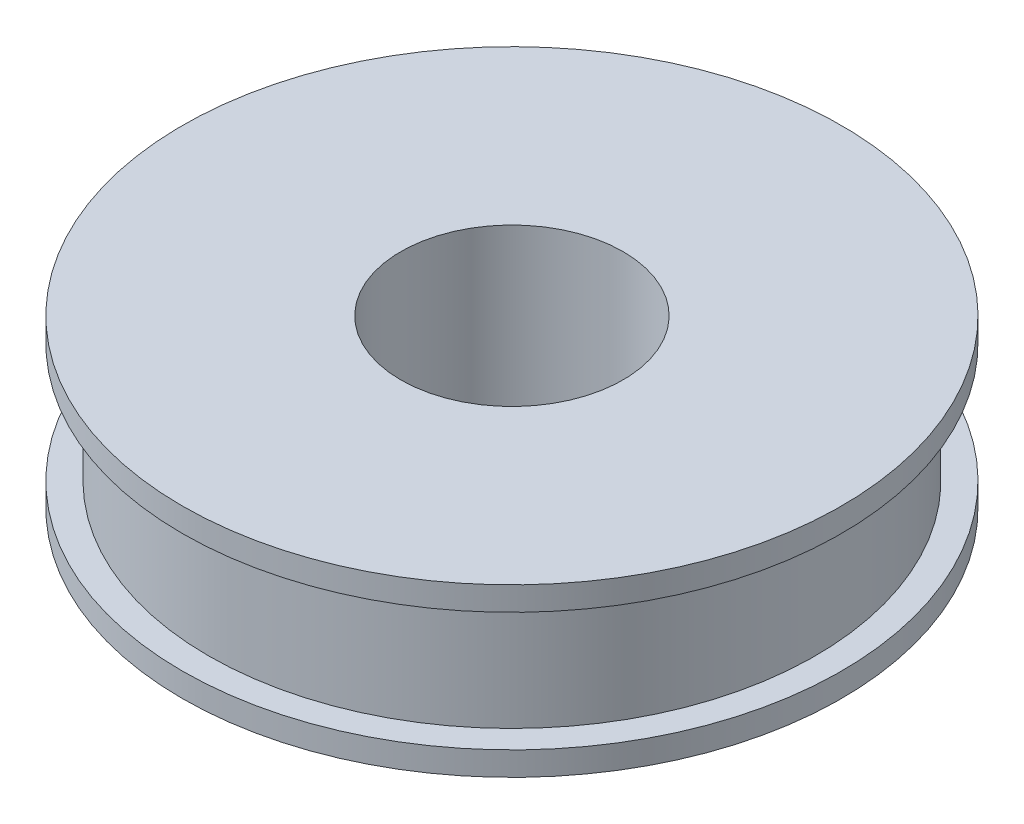
ISO-10303-21;
HEADER;
FILE_DESCRIPTION(('STEP AP214'),'2;1');
FILE_NAME('part.step','',(''),(''),'','','');
FILE_SCHEMA(('AUTOMOTIVE_DESIGN { 1 0 10303 214 1 1 1 1 }'));
ENDSEC;
DATA;
#1=APPLICATION_CONTEXT('core data for automotive mechanical design processes');
#2=APPLICATION_PROTOCOL_DEFINITION('international standard','automotive_design',2000,#1);
#3=PRODUCT_CONTEXT('',#1,'mechanical');
#4=PRODUCT('Part','Part','',(#3));
#5=PRODUCT_RELATED_PRODUCT_CATEGORY('part','',(#4));
#6=PRODUCT_DEFINITION_FORMATION('','',#4);
#7=PRODUCT_DEFINITION_CONTEXT('part definition',#1,'design');
#8=PRODUCT_DEFINITION('design','',#6,#7);
#9=PRODUCT_DEFINITION_SHAPE('','',#8);
#10=(LENGTH_UNIT() NAMED_UNIT(*) SI_UNIT(.MILLI.,.METRE.));
#11=(NAMED_UNIT(*) PLANE_ANGLE_UNIT() SI_UNIT($,.RADIAN.));
#12=(NAMED_UNIT(*) SI_UNIT($,.STERADIAN.) SOLID_ANGLE_UNIT());
#13=UNCERTAINTY_MEASURE_WITH_UNIT(LENGTH_MEASURE(1.E-05),#10,'distance_accuracy_value','');
#14=(GEOMETRIC_REPRESENTATION_CONTEXT(3) GLOBAL_UNCERTAINTY_ASSIGNED_CONTEXT((#13)) GLOBAL_UNIT_ASSIGNED_CONTEXT((#10,
#11,#12)) REPRESENTATION_CONTEXT('',''));
#15=CARTESIAN_POINT('',(0.,0.,0.));
#16=DIRECTION('',(0.,0.,1.));
#17=DIRECTION('',(1.,0.,0.));
#18=AXIS2_PLACEMENT_3D('',#15,#16,#17);
#19=CARTESIAN_POINT('',(0.,3.,0.));
#20=DIRECTION('',(0.,1.,0.));
#21=DIRECTION('',(0.,0.,1.));
#22=AXIS2_PLACEMENT_3D('',#19,#20,#21);
#23=PLANE('',#22);
#24=CARTESIAN_POINT('',(0.,3.,0.));
#25=DIRECTION('',(0.,1.,0.));
#26=DIRECTION('',(0.,0.,1.));
#27=AXIS2_PLACEMENT_3D('',#24,#25,#26);
#28=CIRCLE('',#27,38.195);
#29=CARTESIAN_POINT('',(0.,3.,38.195));
#30=VERTEX_POINT('',#29);
#31=EDGE_CURVE('E10',#30,#30,#28,.T.);
#32=ORIENTED_EDGE('',*,*,#31,.F.);
#33=EDGE_LOOP('',(#32));
#34=FACE_BOUND('',#33,.T.);
#35=CARTESIAN_POINT('',(0.,3.,0.));
#36=DIRECTION('',(0.,1.,0.));
#37=DIRECTION('',(0.,0.,1.));
#38=AXIS2_PLACEMENT_3D('',#35,#36,#37);
#39=CIRCLE('',#38,41.5);
#40=CARTESIAN_POINT('',(0.,3.,41.5));
#41=VERTEX_POINT('',#40);
#42=EDGE_CURVE('E46',#41,#41,#39,.T.);
#43=ORIENTED_EDGE('',*,*,#42,.T.);
#44=EDGE_LOOP('',(#43));
#45=FACE_BOUND('',#44,.T.);
#46=ADVANCED_FACE('F37',(#34,#45),#23,.T.);
#47=CARTESIAN_POINT('',(0.,0.,0.));
#48=DIRECTION('',(0.,1.,0.));
#49=DIRECTION('',(0.,0.,1.));
#50=AXIS2_PLACEMENT_3D('',#47,#48,#49);
#51=PLANE('',#50);
#52=CARTESIAN_POINT('',(0.,0.,0.));
#53=DIRECTION('',(0.,1.,0.));
#54=DIRECTION('',(0.,0.,1.));
#55=AXIS2_PLACEMENT_3D('',#52,#53,#54);
#56=CIRCLE('',#55,41.5);
#57=CARTESIAN_POINT('',(0.,0.,41.5));
#58=VERTEX_POINT('',#57);
#59=EDGE_CURVE('E41',#58,#58,#56,.T.);
#60=ORIENTED_EDGE('',*,*,#59,.F.);
#61=EDGE_LOOP('',(#60));
#62=FACE_BOUND('',#61,.T.);
#63=CARTESIAN_POINT('',(0.,0.,0.));
#64=DIRECTION('',(0.,1.,0.));
#65=DIRECTION('',(0.,0.,1.));
#66=AXIS2_PLACEMENT_3D('',#63,#64,#65);
#67=CIRCLE('',#66,14.);
#68=CARTESIAN_POINT('',(0.,0.,14.));
#69=VERTEX_POINT('',#68);
#70=EDGE_CURVE('E56',#69,#69,#67,.T.);
#71=ORIENTED_EDGE('',*,*,#70,.T.);
#72=EDGE_LOOP('',(#71));
#73=FACE_BOUND('',#72,.T.);
#74=ADVANCED_FACE('F98',(#62,#73),#51,.F.);
#75=CARTESIAN_POINT('',(0.,3.,0.));
#76=DIRECTION('',(0.,-1.,0.));
#77=DIRECTION('',(0.,0.,-1.));
#78=AXIS2_PLACEMENT_3D('',#75,#76,#77);
#79=CYLINDRICAL_SURFACE('',#78,41.5);
#80=ORIENTED_EDGE('',*,*,#42,.F.);
#81=EDGE_LOOP('',(#80));
#82=FACE_BOUND('',#81,.T.);
#83=ORIENTED_EDGE('',*,*,#59,.T.);
#84=EDGE_LOOP('',(#83));
#85=FACE_BOUND('',#84,.T.);
#86=ADVANCED_FACE('F39',(#82,#85),#79,.T.);
#87=CARTESIAN_POINT('',(0.,3.,0.));
#88=DIRECTION('',(0.,-1.,0.));
#89=DIRECTION('',(0.,0.,-1.));
#90=AXIS2_PLACEMENT_3D('',#87,#88,#89);
#91=CYLINDRICAL_SURFACE('',#90,14.);
#92=ORIENTED_EDGE('',*,*,#70,.F.);
#93=EDGE_LOOP('',(#92));
#94=FACE_BOUND('',#93,.T.);
#95=CARTESIAN_POINT('',(0.,21.,0.));
#96=DIRECTION('',(0.,1.,0.));
#97=DIRECTION('',(0.,0.,1.));
#98=AXIS2_PLACEMENT_3D('',#95,#96,#97);
#99=CIRCLE('',#98,14.);
#100=CARTESIAN_POINT('',(0.,21.,14.));
#101=VERTEX_POINT('',#100);
#102=EDGE_CURVE('E76',#101,#101,#99,.T.);
#103=ORIENTED_EDGE('',*,*,#102,.T.);
#104=EDGE_LOOP('',(#103));
#105=FACE_BOUND('',#104,.T.);
#106=ADVANCED_FACE('F82',(#94,#105),#91,.F.);
#107=CARTESIAN_POINT('',(0.,18.,0.));
#108=DIRECTION('',(0.,-1.,0.));
#109=DIRECTION('',(0.,0.,-1.));
#110=AXIS2_PLACEMENT_3D('',#107,#108,#109);
#111=CYLINDRICAL_SURFACE('',#110,38.195);
#112=CARTESIAN_POINT('',(0.,18.,0.));
#113=DIRECTION('',(0.,1.,0.));
#114=DIRECTION('',(0.,0.,1.));
#115=AXIS2_PLACEMENT_3D('',#112,#113,#114);
#116=CIRCLE('',#115,38.195);
#117=CARTESIAN_POINT('',(0.,18.,38.195));
#118=VERTEX_POINT('',#117);
#119=EDGE_CURVE('E54',#118,#118,#116,.T.);
#120=ORIENTED_EDGE('',*,*,#119,.F.);
#121=EDGE_LOOP('',(#120));
#122=FACE_BOUND('',#121,.T.);
#123=ORIENTED_EDGE('',*,*,#31,.T.);
#124=EDGE_LOOP('',(#123));
#125=FACE_BOUND('',#124,.T.);
#126=ADVANCED_FACE('F87',(#122,#125),#111,.T.);
#127=CARTESIAN_POINT('',(0.,21.,0.));
#128=DIRECTION('',(0.,1.,0.));
#129=DIRECTION('',(0.,0.,1.));
#130=AXIS2_PLACEMENT_3D('',#127,#128,#129);
#131=PLANE('',#130);
#132=CARTESIAN_POINT('',(0.,21.,0.));
#133=DIRECTION('',(0.,1.,0.));
#134=DIRECTION('',(0.,0.,1.));
#135=AXIS2_PLACEMENT_3D('',#132,#133,#134);
#136=CIRCLE('',#135,41.5);
#137=CARTESIAN_POINT('',(0.,21.,41.5));
#138=VERTEX_POINT('',#137);
#139=EDGE_CURVE('E65',#138,#138,#136,.T.);
#140=ORIENTED_EDGE('',*,*,#139,.T.);
#141=EDGE_LOOP('',(#140));
#142=FACE_BOUND('',#141,.T.);
#143=ORIENTED_EDGE('',*,*,#102,.F.);
#144=EDGE_LOOP('',(#143));
#145=FACE_BOUND('',#144,.T.);
#146=ADVANCED_FACE('F84',(#142,#145),#131,.T.);
#147=CARTESIAN_POINT('',(0.,18.,0.));
#148=DIRECTION('',(0.,1.,0.));
#149=DIRECTION('',(0.,0.,1.));
#150=AXIS2_PLACEMENT_3D('',#147,#148,#149);
#151=PLANE('',#150);
#152=ORIENTED_EDGE('',*,*,#119,.T.);
#153=EDGE_LOOP('',(#152));
#154=FACE_BOUND('',#153,.T.);
#155=CARTESIAN_POINT('',(0.,18.,0.));
#156=DIRECTION('',(0.,1.,0.));
#157=DIRECTION('',(0.,0.,1.));
#158=AXIS2_PLACEMENT_3D('',#155,#156,#157);
#159=CIRCLE('',#158,41.5);
#160=CARTESIAN_POINT('',(0.,18.,41.5));
#161=VERTEX_POINT('',#160);
#162=EDGE_CURVE('E70',#161,#161,#159,.T.);
#163=ORIENTED_EDGE('',*,*,#162,.F.);
#164=EDGE_LOOP('',(#163));
#165=FACE_BOUND('',#164,.T.);
#166=ADVANCED_FACE('F86',(#154,#165),#151,.F.);
#167=CARTESIAN_POINT('',(0.,21.,0.));
#168=DIRECTION('',(0.,-1.,0.));
#169=DIRECTION('',(0.,0.,-1.));
#170=AXIS2_PLACEMENT_3D('',#167,#168,#169);
#171=CYLINDRICAL_SURFACE('',#170,41.5);
#172=ORIENTED_EDGE('',*,*,#139,.F.);
#173=EDGE_LOOP('',(#172));
#174=FACE_BOUND('',#173,.T.);
#175=ORIENTED_EDGE('',*,*,#162,.T.);
#176=EDGE_LOOP('',(#175));
#177=FACE_BOUND('',#176,.T.);
#178=ADVANCED_FACE('F93',(#174,#177),#171,.T.);
#179=CLOSED_SHELL('',(#46,#74,#86,#106,#126,#146,#166,#178));
#180=MANIFOLD_SOLID_BREP('B2',#179);
#181=ADVANCED_BREP_SHAPE_REPRESENTATION('',(#18,#180),#14);
#182=SHAPE_DEFINITION_REPRESENTATION(#9,#181);
ENDSEC;
END-ISO-10303-21;
